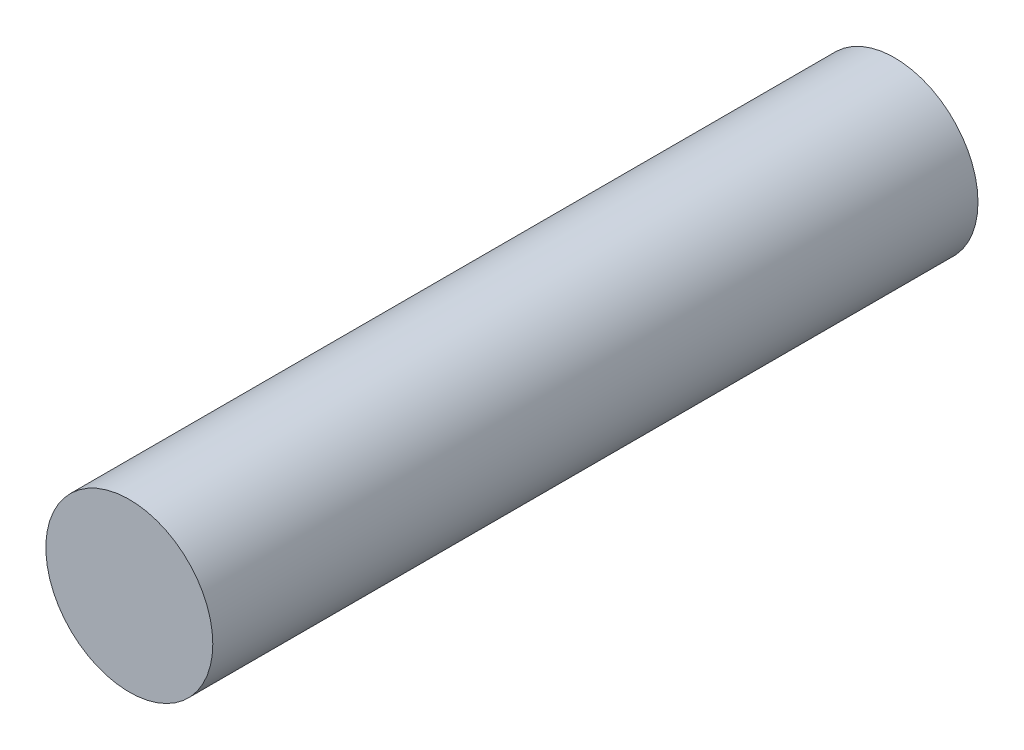
ISO-10303-21;
HEADER;
FILE_DESCRIPTION(('STEP AP214'),'2;1');
FILE_NAME('part.step','',(''),(''),'','','');
FILE_SCHEMA(('AUTOMOTIVE_DESIGN { 1 0 10303 214 1 1 1 1 }'));
ENDSEC;
DATA;
#1=APPLICATION_CONTEXT('core data for automotive mechanical design processes');
#2=APPLICATION_PROTOCOL_DEFINITION('international standard','automotive_design',2000,#1);
#3=PRODUCT_CONTEXT('',#1,'mechanical');
#4=PRODUCT('Part','Part','',(#3));
#5=PRODUCT_RELATED_PRODUCT_CATEGORY('part','',(#4));
#6=PRODUCT_DEFINITION_FORMATION('','',#4);
#7=PRODUCT_DEFINITION_CONTEXT('part definition',#1,'design');
#8=PRODUCT_DEFINITION('design','',#6,#7);
#9=PRODUCT_DEFINITION_SHAPE('','',#8);
#10=(LENGTH_UNIT() NAMED_UNIT(*) SI_UNIT(.MILLI.,.METRE.));
#11=(NAMED_UNIT(*) PLANE_ANGLE_UNIT() SI_UNIT($,.RADIAN.));
#12=(NAMED_UNIT(*) SI_UNIT($,.STERADIAN.) SOLID_ANGLE_UNIT());
#13=UNCERTAINTY_MEASURE_WITH_UNIT(LENGTH_MEASURE(1.E-05),#10,'distance_accuracy_value','');
#14=(GEOMETRIC_REPRESENTATION_CONTEXT(3) GLOBAL_UNCERTAINTY_ASSIGNED_CONTEXT((#13)) GLOBAL_UNIT_ASSIGNED_CONTEXT((#10,
#11,#12)) REPRESENTATION_CONTEXT('',''));
#15=CARTESIAN_POINT('',(0.,0.,0.));
#16=DIRECTION('',(0.,0.,1.));
#17=DIRECTION('',(1.,0.,0.));
#18=AXIS2_PLACEMENT_3D('',#15,#16,#17);
#19=CARTESIAN_POINT('',(0.,0.,55.));
#20=DIRECTION('',(0.,0.,-1.));
#21=DIRECTION('',(-1.,0.,0.));
#22=AXIS2_PLACEMENT_3D('',#19,#20,#21);
#23=CYLINDRICAL_SURFACE('',#22,6.);
#24=CARTESIAN_POINT('',(0.,0.,55.));
#25=DIRECTION('',(0.,0.,1.));
#26=DIRECTION('',(1.,0.,0.));
#27=AXIS2_PLACEMENT_3D('',#24,#25,#26);
#28=CIRCLE('',#27,6.);
#29=CARTESIAN_POINT('',(6.,0.,55.));
#30=VERTEX_POINT('',#29);
#31=EDGE_CURVE('E10',#30,#30,#28,.T.);
#32=ORIENTED_EDGE('',*,*,#31,.F.);
#33=EDGE_LOOP('',(#32));
#34=FACE_BOUND('',#33,.T.);
#35=CARTESIAN_POINT('',(0.,0.,0.));
#36=DIRECTION('',(0.,0.,1.));
#37=DIRECTION('',(1.,0.,0.));
#38=AXIS2_PLACEMENT_3D('',#35,#36,#37);
#39=CIRCLE('',#38,6.);
#40=CARTESIAN_POINT('',(6.,0.,0.));
#41=VERTEX_POINT('',#40);
#42=EDGE_CURVE('E33',#41,#41,#39,.T.);
#43=ORIENTED_EDGE('',*,*,#42,.T.);
#44=EDGE_LOOP('',(#43));
#45=FACE_BOUND('',#44,.T.);
#46=ADVANCED_FACE('F30',(#34,#45),#23,.T.);
#47=CARTESIAN_POINT('',(0.,0.,55.));
#48=DIRECTION('',(0.,0.,1.));
#49=DIRECTION('',(1.,0.,0.));
#50=AXIS2_PLACEMENT_3D('',#47,#48,#49);
#51=PLANE('',#50);
#52=ORIENTED_EDGE('',*,*,#31,.T.);
#53=EDGE_LOOP('',(#52));
#54=FACE_BOUND('',#53,.T.);
#55=ADVANCED_FACE('F45',(#54),#51,.T.);
#56=CARTESIAN_POINT('',(0.,0.,0.));
#57=DIRECTION('',(0.,0.,1.));
#58=DIRECTION('',(1.,0.,0.));
#59=AXIS2_PLACEMENT_3D('',#56,#57,#58);
#60=PLANE('',#59);
#61=ORIENTED_EDGE('',*,*,#42,.F.);
#62=EDGE_LOOP('',(#61));
#63=FACE_BOUND('',#62,.T.);
#64=ADVANCED_FACE('F43',(#63),#60,.F.);
#65=CLOSED_SHELL('',(#46,#55,#64));
#66=MANIFOLD_SOLID_BREP('B2',#65);
#67=ADVANCED_BREP_SHAPE_REPRESENTATION('',(#18,#66),#14);
#68=SHAPE_DEFINITION_REPRESENTATION(#9,#67);
ENDSEC;
END-ISO-10303-21;
